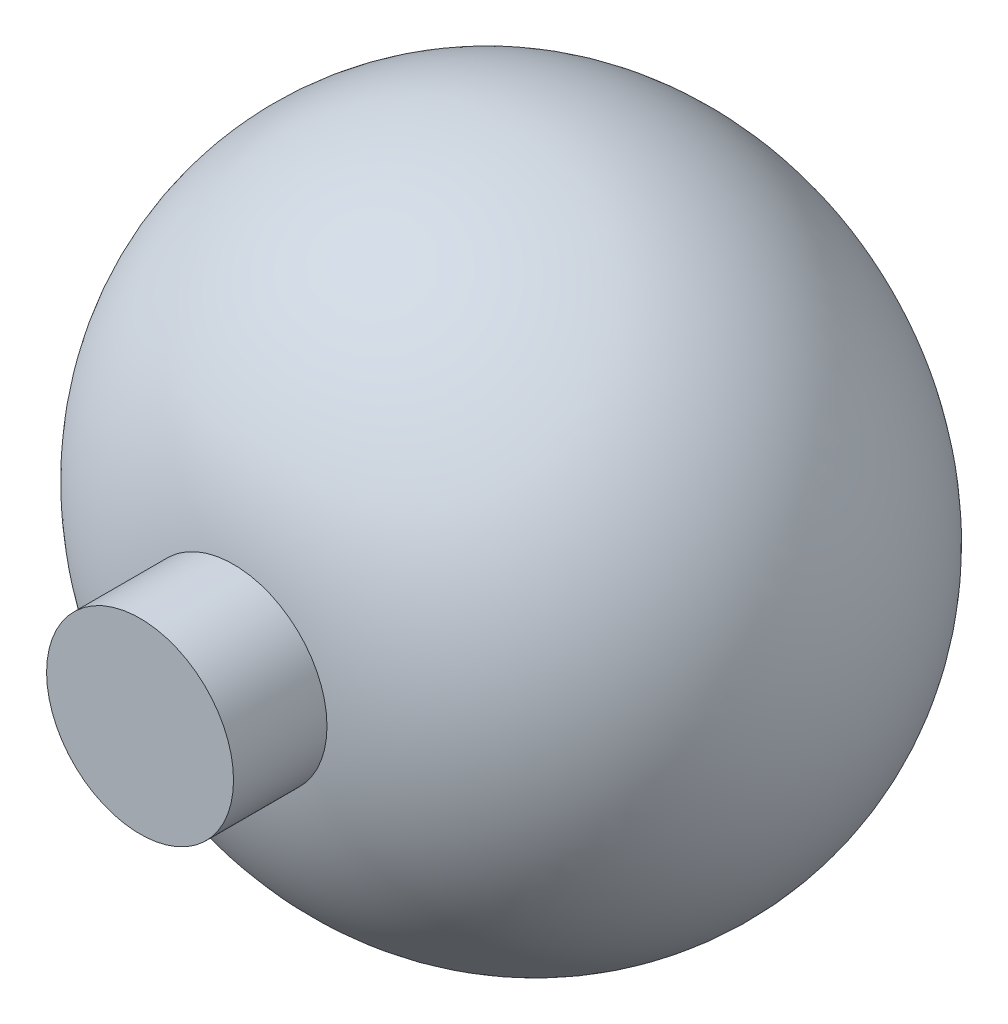
ISO-10303-21;
HEADER;
FILE_DESCRIPTION(('STEP AP214'),'2;1');
FILE_NAME('part.step','',(''),(''),'','','');
FILE_SCHEMA(('AUTOMOTIVE_DESIGN { 1 0 10303 214 1 1 1 1 }'));
ENDSEC;
DATA;
#1=APPLICATION_CONTEXT('core data for automotive mechanical design processes');
#2=APPLICATION_PROTOCOL_DEFINITION('international standard','automotive_design',2000,#1);
#3=PRODUCT_CONTEXT('',#1,'mechanical');
#4=PRODUCT('Part','Part','',(#3));
#5=PRODUCT_RELATED_PRODUCT_CATEGORY('part','',(#4));
#6=PRODUCT_DEFINITION_FORMATION('','',#4);
#7=PRODUCT_DEFINITION_CONTEXT('part definition',#1,'design');
#8=PRODUCT_DEFINITION('design','',#6,#7);
#9=PRODUCT_DEFINITION_SHAPE('','',#8);
#10=(LENGTH_UNIT() NAMED_UNIT(*) SI_UNIT(.MILLI.,.METRE.));
#11=(NAMED_UNIT(*) PLANE_ANGLE_UNIT() SI_UNIT($,.RADIAN.));
#12=(NAMED_UNIT(*) SI_UNIT($,.STERADIAN.) SOLID_ANGLE_UNIT());
#13=UNCERTAINTY_MEASURE_WITH_UNIT(LENGTH_MEASURE(1.E-05),#10,'distance_accuracy_value','');
#14=(GEOMETRIC_REPRESENTATION_CONTEXT(3) GLOBAL_UNCERTAINTY_ASSIGNED_CONTEXT((#13)) GLOBAL_UNIT_ASSIGNED_CONTEXT((#10,
#11,#12)) REPRESENTATION_CONTEXT('',''));
#15=CARTESIAN_POINT('',(0.,0.,0.));
#16=DIRECTION('',(0.,0.,1.));
#17=DIRECTION('',(1.,0.,0.));
#18=AXIS2_PLACEMENT_3D('',#15,#16,#17);
#19=CARTESIAN_POINT('',(0.,0.,-34.6993458925277));
#20=DIRECTION('',(0.,0.,-1.));
#21=DIRECTION('',(-1.,0.,0.));
#22=AXIS2_PLACEMENT_3D('',#19,#20,#21);
#23=PLANE('',#22);
#24=CARTESIAN_POINT('',(0.,0.,-34.6993458925277));
#25=DIRECTION('',(0.,0.,-1.));
#26=DIRECTION('',(-1.,0.,0.));
#27=AXIS2_PLACEMENT_3D('',#24,#25,#26);
#28=CIRCLE('',#27,5.);
#29=CARTESIAN_POINT('',(-5.,0.,-34.6993458925277));
#30=VERTEX_POINT('',#29);
#31=EDGE_CURVE('E43',#30,#30,#28,.T.);
#32=ORIENTED_EDGE('',*,*,#31,.T.);
#33=EDGE_LOOP('',(#32));
#34=FACE_BOUND('',#33,.T.);
#35=ADVANCED_FACE('F33',(#34),#23,.T.);
#36=CARTESIAN_POINT('',(0.,0.,0.));
#37=DIRECTION('',(0.,0.,1.));
#38=DIRECTION('',(1.,0.,0.));
#39=AXIS2_PLACEMENT_3D('',#36,#37,#38);
#40=PLANE('',#39);
#41=CARTESIAN_POINT('',(0.,0.,0.));
#42=DIRECTION('',(0.,0.,-1.));
#43=DIRECTION('',(-1.,0.,0.));
#44=AXIS2_PLACEMENT_3D('',#41,#42,#43);
#45=CIRCLE('',#44,5.);
#46=CARTESIAN_POINT('',(-5.,0.,0.));
#47=VERTEX_POINT('',#46);
#48=EDGE_CURVE('E10',#47,#47,#45,.T.);
#49=ORIENTED_EDGE('',*,*,#48,.F.);
#50=EDGE_LOOP('',(#49));
#51=FACE_BOUND('',#50,.T.);
#52=ADVANCED_FACE('F58',(#51),#40,.T.);
#53=CARTESIAN_POINT('',(0.,0.,-34.6993458925277));
#54=DIRECTION('',(0.,0.,-1.));
#55=DIRECTION('',(-1.,0.,0.));
#56=AXIS2_PLACEMENT_3D('',#53,#54,#55);
#57=CYLINDRICAL_SURFACE('',#56,5.);
#58=ORIENTED_EDGE('',*,*,#48,.T.);
#59=EDGE_LOOP('',(#58));
#60=FACE_BOUND('',#59,.T.);
#61=CARTESIAN_POINT('',(0.,0.,-5.));
#62=DIRECTION('',(0.,0.,-1.));
#63=DIRECTION('',(-1.,0.,0.));
#64=AXIS2_PLACEMENT_3D('',#61,#62,#63);
#65=CIRCLE('',#64,5.);
#66=CARTESIAN_POINT('',(-5.,0.,-5.));
#67=VERTEX_POINT('',#66);
#68=EDGE_CURVE('E39',#67,#67,#65,.T.);
#69=ORIENTED_EDGE('',*,*,#68,.F.);
#70=EDGE_LOOP('',(#69));
#71=FACE_BOUND('',#70,.T.);
#72=ADVANCED_FACE('F53',(#60,#71),#57,.T.);
#73=CARTESIAN_POINT('',(0.,0.,-19.8496729462639));
#74=DIRECTION('',(0.,0.,-1.));
#75=DIRECTION('',(-1.,0.,0.));
#76=AXIS2_PLACEMENT_3D('',#73,#74,#75);
#77=DEGENERATE_TOROIDAL_SURFACE('',#76,2.88169563353158,15.,.T.);
#78=ORIENTED_EDGE('',*,*,#68,.T.);
#79=EDGE_LOOP('',(#78));
#80=FACE_BOUND('',#79,.T.);
#81=ORIENTED_EDGE('',*,*,#31,.F.);
#82=EDGE_LOOP('',(#81));
#83=FACE_BOUND('',#82,.T.);
#84=ADVANCED_FACE('F51',(#80,#83),#77,.T.);
#85=CLOSED_SHELL('',(#35,#52,#72,#84));
#86=MANIFOLD_SOLID_BREP('B2',#85);
#87=ADVANCED_BREP_SHAPE_REPRESENTATION('',(#18,#86),#14);
#88=SHAPE_DEFINITION_REPRESENTATION(#9,#87);
ENDSEC;
END-ISO-10303-21;
